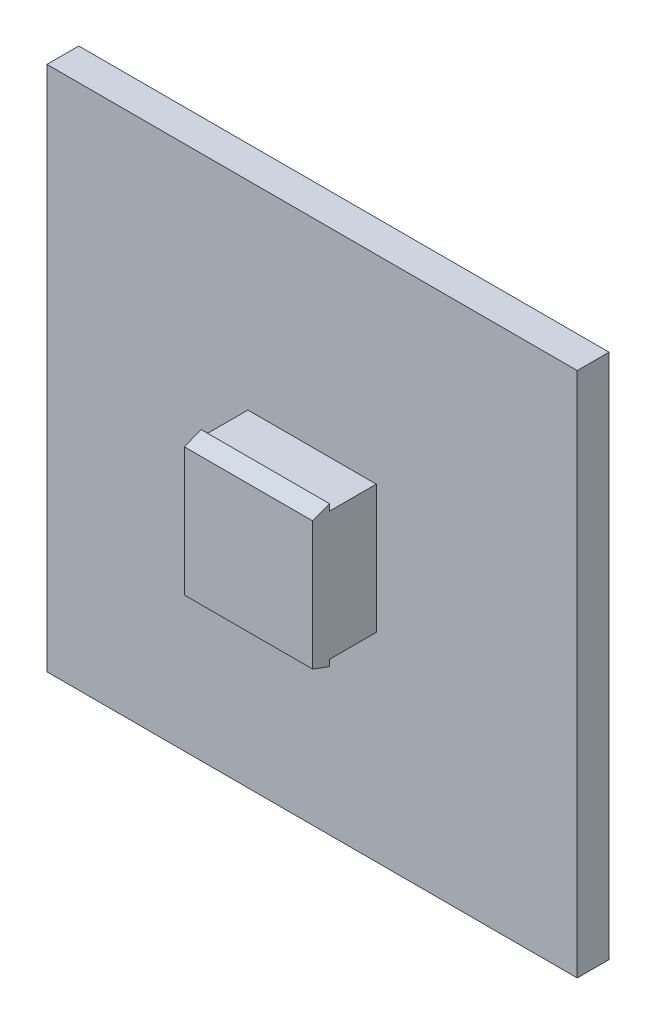
ISO-10303-21;
HEADER;
FILE_DESCRIPTION(('STEP AP214'),'2;1');
FILE_NAME('part.step','',(''),(''),'','','');
FILE_SCHEMA(('AUTOMOTIVE_DESIGN { 1 0 10303 214 1 1 1 1 }'));
ENDSEC;
DATA;
#1=APPLICATION_CONTEXT('core data for automotive mechanical design processes');
#2=APPLICATION_PROTOCOL_DEFINITION('international standard','automotive_design',2000,#1);
#3=PRODUCT_CONTEXT('',#1,'mechanical');
#4=PRODUCT('Part','Part','',(#3));
#5=PRODUCT_RELATED_PRODUCT_CATEGORY('part','',(#4));
#6=PRODUCT_DEFINITION_FORMATION('','',#4);
#7=PRODUCT_DEFINITION_CONTEXT('part definition',#1,'design');
#8=PRODUCT_DEFINITION('design','',#6,#7);
#9=PRODUCT_DEFINITION_SHAPE('','',#8);
#10=(LENGTH_UNIT() NAMED_UNIT(*) SI_UNIT(.MILLI.,.METRE.));
#11=(NAMED_UNIT(*) PLANE_ANGLE_UNIT() SI_UNIT($,.RADIAN.));
#12=(NAMED_UNIT(*) SI_UNIT($,.STERADIAN.) SOLID_ANGLE_UNIT());
#13=UNCERTAINTY_MEASURE_WITH_UNIT(LENGTH_MEASURE(1.E-05),#10,'distance_accuracy_value','');
#14=(GEOMETRIC_REPRESENTATION_CONTEXT(3) GLOBAL_UNCERTAINTY_ASSIGNED_CONTEXT((#13)) GLOBAL_UNIT_ASSIGNED_CONTEXT((#10,
#11,#12)) REPRESENTATION_CONTEXT('',''));
#15=CARTESIAN_POINT('',(0.,0.,0.));
#16=DIRECTION('',(0.,0.,1.));
#17=DIRECTION('',(1.,0.,0.));
#18=AXIS2_PLACEMENT_3D('',#15,#16,#17);
#19=CARTESIAN_POINT('',(12.5,12.4,1.5));
#20=DIRECTION('',(0.,-1.,0.));
#21=DIRECTION('',(0.,0.,-1.));
#22=AXIS2_PLACEMENT_3D('',#19,#20,#21);
#23=PLANE('',#22);
#24=DIRECTION('',(-1.,0.,0.));
#25=VECTOR('',#24,1.);
#26=CARTESIAN_POINT('',(12.5,12.4,0.));
#27=LINE('',#26,#25);
#28=CARTESIAN_POINT('',(12.5,12.4,0.));
#29=VERTEX_POINT('',#28);
#30=CARTESIAN_POINT('',(-12.5,12.4,0.));
#31=VERTEX_POINT('',#30);
#32=EDGE_CURVE('E190',#29,#31,#27,.T.);
#33=ORIENTED_EDGE('',*,*,#32,.T.);
#34=DIRECTION('',(0.,0.,-1.));
#35=VECTOR('',#34,1.);
#36=CARTESIAN_POINT('',(-12.5,12.4,1.5));
#37=LINE('',#36,#35);
#38=CARTESIAN_POINT('',(-12.5,12.4,1.5));
#39=VERTEX_POINT('',#38);
#40=EDGE_CURVE('E11',#39,#31,#37,.T.);
#41=ORIENTED_EDGE('',*,*,#40,.F.);
#42=DIRECTION('',(-1.,0.,0.));
#43=VECTOR('',#42,1.);
#44=CARTESIAN_POINT('',(12.5,12.4,1.5));
#45=LINE('',#44,#43);
#46=CARTESIAN_POINT('',(12.5,12.4,1.5));
#47=VERTEX_POINT('',#46);
#48=EDGE_CURVE('E196',#47,#39,#45,.T.);
#49=ORIENTED_EDGE('',*,*,#48,.F.);
#50=DIRECTION('',(0.,0.,-1.));
#51=VECTOR('',#50,1.);
#52=CARTESIAN_POINT('',(12.5,12.4,1.5));
#53=LINE('',#52,#51);
#54=EDGE_CURVE('E206',#47,#29,#53,.T.);
#55=ORIENTED_EDGE('',*,*,#54,.T.);
#56=EDGE_LOOP('',(#33,#41,#49,#55));
#57=FACE_BOUND('',#56,.T.);
#58=ADVANCED_FACE('F39',(#57),#23,.F.);
#59=CARTESIAN_POINT('',(-12.5,-12.4,1.5));
#60=DIRECTION('',(1.,0.,0.));
#61=DIRECTION('',(0.,0.,-1.));
#62=AXIS2_PLACEMENT_3D('',#59,#60,#61);
#63=PLANE('',#62);
#64=DIRECTION('',(0.,-1.,0.));
#65=VECTOR('',#64,1.);
#66=CARTESIAN_POINT('',(-12.5,-12.4,0.));
#67=LINE('',#66,#65);
#68=CARTESIAN_POINT('',(-12.5,-12.4,0.));
#69=VERTEX_POINT('',#68);
#70=EDGE_CURVE('E209',#31,#69,#67,.T.);
#71=ORIENTED_EDGE('',*,*,#70,.T.);
#72=DIRECTION('',(0.,0.,-1.));
#73=VECTOR('',#72,1.);
#74=CARTESIAN_POINT('',(-12.5,-12.4,1.5));
#75=LINE('',#74,#73);
#76=CARTESIAN_POINT('',(-12.5,-12.4,1.5));
#77=VERTEX_POINT('',#76);
#78=EDGE_CURVE('E46',#77,#69,#75,.T.);
#79=ORIENTED_EDGE('',*,*,#78,.F.);
#80=DIRECTION('',(0.,-1.,0.));
#81=VECTOR('',#80,1.);
#82=CARTESIAN_POINT('',(-12.5,-12.4,1.5));
#83=LINE('',#82,#81);
#84=EDGE_CURVE('E199',#39,#77,#83,.T.);
#85=ORIENTED_EDGE('',*,*,#84,.F.);
#86=ORIENTED_EDGE('',*,*,#40,.T.);
#87=EDGE_LOOP('',(#71,#79,#85,#86));
#88=FACE_BOUND('',#87,.T.);
#89=ADVANCED_FACE('F239',(#88),#63,.F.);
#90=CARTESIAN_POINT('',(12.5,-12.4,1.5));
#91=DIRECTION('',(0.,1.,0.));
#92=DIRECTION('',(0.,0.,1.));
#93=AXIS2_PLACEMENT_3D('',#90,#91,#92);
#94=PLANE('',#93);
#95=DIRECTION('',(1.,0.,0.));
#96=VECTOR('',#95,1.);
#97=CARTESIAN_POINT('',(12.5,-12.4,0.));
#98=LINE('',#97,#96);
#99=CARTESIAN_POINT('',(12.5,-12.4,0.));
#100=VERTEX_POINT('',#99);
#101=EDGE_CURVE('E211',#69,#100,#98,.T.);
#102=ORIENTED_EDGE('',*,*,#101,.T.);
#103=DIRECTION('',(0.,0.,-1.));
#104=VECTOR('',#103,1.);
#105=CARTESIAN_POINT('',(12.5,-12.4,1.5));
#106=LINE('',#105,#104);
#107=CARTESIAN_POINT('',(12.5,-12.4,1.5));
#108=VERTEX_POINT('',#107);
#109=EDGE_CURVE('E216',#108,#100,#106,.T.);
#110=ORIENTED_EDGE('',*,*,#109,.F.);
#111=DIRECTION('',(1.,0.,0.));
#112=VECTOR('',#111,1.);
#113=CARTESIAN_POINT('',(12.5,-12.4,1.5));
#114=LINE('',#113,#112);
#115=EDGE_CURVE('E202',#77,#108,#114,.T.);
#116=ORIENTED_EDGE('',*,*,#115,.F.);
#117=ORIENTED_EDGE('',*,*,#78,.T.);
#118=EDGE_LOOP('',(#102,#110,#116,#117));
#119=FACE_BOUND('',#118,.T.);
#120=ADVANCED_FACE('F223',(#119),#94,.F.);
#121=CARTESIAN_POINT('',(12.5,-12.4,1.5));
#122=DIRECTION('',(-1.,0.,0.));
#123=DIRECTION('',(0.,0.,1.));
#124=AXIS2_PLACEMENT_3D('',#121,#122,#123);
#125=PLANE('',#124);
#126=DIRECTION('',(0.,1.,0.));
#127=VECTOR('',#126,1.);
#128=CARTESIAN_POINT('',(12.5,-12.4,0.));
#129=LINE('',#128,#127);
#130=EDGE_CURVE('E200',#100,#29,#129,.T.);
#131=ORIENTED_EDGE('',*,*,#130,.T.);
#132=ORIENTED_EDGE('',*,*,#54,.F.);
#133=DIRECTION('',(0.,1.,0.));
#134=VECTOR('',#133,1.);
#135=CARTESIAN_POINT('',(12.5,-12.4,1.5));
#136=LINE('',#135,#134);
#137=EDGE_CURVE('E204',#108,#47,#136,.T.);
#138=ORIENTED_EDGE('',*,*,#137,.F.);
#139=ORIENTED_EDGE('',*,*,#109,.T.);
#140=EDGE_LOOP('',(#131,#132,#138,#139));
#141=FACE_BOUND('',#140,.T.);
#142=ADVANCED_FACE('F232',(#141),#125,.F.);
#143=CARTESIAN_POINT('',(0.,0.,1.5));
#144=DIRECTION('',(0.,0.,-1.));
#145=DIRECTION('',(-1.,0.,0.));
#146=AXIS2_PLACEMENT_3D('',#143,#144,#145);
#147=PLANE('',#146);
#148=DIRECTION('',(1.,0.,0.));
#149=VECTOR('',#148,1.);
#150=CARTESIAN_POINT('',(-3.025,-3.025,1.5));
#151=LINE('',#150,#149);
#152=CARTESIAN_POINT('',(-3.025,-3.025,1.5));
#153=VERTEX_POINT('',#152);
#154=CARTESIAN_POINT('',(3.025,-3.025,1.5));
#155=VERTEX_POINT('',#154);
#156=EDGE_CURVE('E171',#153,#155,#151,.T.);
#157=ORIENTED_EDGE('',*,*,#156,.F.);
#158=DIRECTION('',(0.,1.,0.));
#159=VECTOR('',#158,1.);
#160=CARTESIAN_POINT('',(-3.025,-3.025,1.5));
#161=LINE('',#160,#159);
#162=CARTESIAN_POINT('',(-3.025,3.025,1.5));
#163=VERTEX_POINT('',#162);
#164=EDGE_CURVE('E158',#153,#163,#161,.T.);
#165=ORIENTED_EDGE('',*,*,#164,.T.);
#166=DIRECTION('',(1.,0.,0.));
#167=VECTOR('',#166,1.);
#168=CARTESIAN_POINT('',(-3.025,3.025,1.5));
#169=LINE('',#168,#167);
#170=CARTESIAN_POINT('',(3.025,3.025,1.5));
#171=VERTEX_POINT('',#170);
#172=EDGE_CURVE('E180',#163,#171,#169,.T.);
#173=ORIENTED_EDGE('',*,*,#172,.T.);
#174=DIRECTION('',(0.,1.,0.));
#175=VECTOR('',#174,1.);
#176=CARTESIAN_POINT('',(3.025,-3.025,1.5));
#177=LINE('',#176,#175);
#178=EDGE_CURVE('E183',#155,#171,#177,.T.);
#179=ORIENTED_EDGE('',*,*,#178,.F.);
#180=EDGE_LOOP('',(#157,#165,#173,#179));
#181=FACE_BOUND('',#180,.T.);
#182=ORIENTED_EDGE('',*,*,#48,.T.);
#183=ORIENTED_EDGE('',*,*,#84,.T.);
#184=ORIENTED_EDGE('',*,*,#115,.T.);
#185=ORIENTED_EDGE('',*,*,#137,.T.);
#186=EDGE_LOOP('',(#182,#183,#184,#185));
#187=FACE_BOUND('',#186,.T.);
#188=ADVANCED_FACE('F238',(#181,#187),#147,.F.);
#189=CARTESIAN_POINT('',(0.,0.,0.));
#190=DIRECTION('',(0.,0.,-1.));
#191=DIRECTION('',(-1.,0.,0.));
#192=AXIS2_PLACEMENT_3D('',#189,#190,#191);
#193=PLANE('',#192);
#194=ORIENTED_EDGE('',*,*,#32,.F.);
#195=ORIENTED_EDGE('',*,*,#130,.F.);
#196=ORIENTED_EDGE('',*,*,#101,.F.);
#197=ORIENTED_EDGE('',*,*,#70,.F.);
#198=EDGE_LOOP('',(#194,#195,#196,#197));
#199=FACE_BOUND('',#198,.T.);
#200=ADVANCED_FACE('F229',(#199),#193,.T.);
#201=CARTESIAN_POINT('',(-3.025,-3.025,4.5));
#202=DIRECTION('',(-1.,0.,0.));
#203=DIRECTION('',(0.,0.,1.));
#204=AXIS2_PLACEMENT_3D('',#201,#202,#203);
#205=PLANE('',#204);
#206=ORIENTED_EDGE('',*,*,#164,.F.);
#207=DIRECTION('',(0.,0.,-1.));
#208=VECTOR('',#207,1.);
#209=CARTESIAN_POINT('',(-3.025,-3.025,4.5));
#210=LINE('',#209,#208);
#211=CARTESIAN_POINT('',(-3.025,-3.025,3.7));
#212=VERTEX_POINT('',#211);
#213=EDGE_CURVE('E188',#212,#153,#210,.T.);
#214=ORIENTED_EDGE('',*,*,#213,.F.);
#215=DIRECTION('',(0.,-1.,0.));
#216=VECTOR('',#215,1.);
#217=CARTESIAN_POINT('',(-3.025,-3.025,3.7));
#218=LINE('',#217,#216);
#219=CARTESIAN_POINT('',(-3.025,-3.325,3.7));
#220=VERTEX_POINT('',#219);
#221=EDGE_CURVE('E148',#212,#220,#218,.T.);
#222=ORIENTED_EDGE('',*,*,#221,.T.);
#223=DIRECTION('',(0.,0.351123441588392,0.936329177569045));
#224=VECTOR('',#223,1.);
#225=CARTESIAN_POINT('',(-3.025,-3.325,3.7));
#226=LINE('',#225,#224);
#227=CARTESIAN_POINT('',(-3.025,-3.025,4.5));
#228=VERTEX_POINT('',#227);
#229=EDGE_CURVE('E151',#220,#228,#226,.T.);
#230=ORIENTED_EDGE('',*,*,#229,.T.);
#231=DIRECTION('',(0.,1.,0.));
#232=VECTOR('',#231,1.);
#233=CARTESIAN_POINT('',(-3.025,-3.025,4.5));
#234=LINE('',#233,#232);
#235=CARTESIAN_POINT('',(-3.025,3.025,4.5));
#236=VERTEX_POINT('',#235);
#237=EDGE_CURVE('E147',#228,#236,#234,.T.);
#238=ORIENTED_EDGE('',*,*,#237,.T.);
#239=DIRECTION('',(0.,0.351123441588392,-0.936329177569045));
#240=VECTOR('',#239,1.);
#241=CARTESIAN_POINT('',(-3.025,3.325,3.7));
#242=LINE('',#241,#240);
#243=CARTESIAN_POINT('',(-3.025,3.325,3.7));
#244=VERTEX_POINT('',#243);
#245=EDGE_CURVE('E131',#236,#244,#242,.T.);
#246=ORIENTED_EDGE('',*,*,#245,.T.);
#247=DIRECTION('',(0.,-1.,0.));
#248=VECTOR('',#247,1.);
#249=CARTESIAN_POINT('',(-3.025,3.025,3.7));
#250=LINE('',#249,#248);
#251=CARTESIAN_POINT('',(-3.025,3.025,3.7));
#252=VERTEX_POINT('',#251);
#253=EDGE_CURVE('E136',#244,#252,#250,.T.);
#254=ORIENTED_EDGE('',*,*,#253,.T.);
#255=DIRECTION('',(0.,0.,-1.));
#256=VECTOR('',#255,1.);
#257=CARTESIAN_POINT('',(-3.025,3.025,4.5));
#258=LINE('',#257,#256);
#259=EDGE_CURVE('E58',#252,#163,#258,.T.);
#260=ORIENTED_EDGE('',*,*,#259,.T.);
#261=EDGE_LOOP('',(#206,#214,#222,#230,#238,#246,#254,#260));
#262=FACE_BOUND('',#261,.T.);
#263=ADVANCED_FACE('F144',(#262),#205,.T.);
#264=CARTESIAN_POINT('',(-3.025,-3.025,4.5));
#265=DIRECTION('',(0.,1.,0.));
#266=DIRECTION('',(0.,0.,1.));
#267=AXIS2_PLACEMENT_3D('',#264,#265,#266);
#268=PLANE('',#267);
#269=DIRECTION('',(0.,0.,-1.));
#270=VECTOR('',#269,1.);
#271=CARTESIAN_POINT('',(3.025,-3.025,4.5));
#272=LINE('',#271,#270);
#273=CARTESIAN_POINT('',(3.025,-3.025,3.7));
#274=VERTEX_POINT('',#273);
#275=EDGE_CURVE('E191',#274,#155,#272,.T.);
#276=ORIENTED_EDGE('',*,*,#275,.F.);
#277=DIRECTION('',(-1.,0.,0.));
#278=VECTOR('',#277,1.);
#279=CARTESIAN_POINT('',(3.87940037453175,-3.025,3.7));
#280=LINE('',#279,#278);
#281=EDGE_CURVE('E164',#274,#212,#280,.T.);
#282=ORIENTED_EDGE('',*,*,#281,.T.);
#283=ORIENTED_EDGE('',*,*,#213,.T.);
#284=ORIENTED_EDGE('',*,*,#156,.T.);
#285=EDGE_LOOP('',(#276,#282,#283,#284));
#286=FACE_BOUND('',#285,.T.);
#287=ADVANCED_FACE('F256',(#286),#268,.F.);
#288=CARTESIAN_POINT('',(3.025,-3.025,4.5));
#289=DIRECTION('',(-1.,0.,0.));
#290=DIRECTION('',(0.,0.,1.));
#291=AXIS2_PLACEMENT_3D('',#288,#289,#290);
#292=PLANE('',#291);
#293=ORIENTED_EDGE('',*,*,#178,.T.);
#294=DIRECTION('',(0.,0.,-1.));
#295=VECTOR('',#294,1.);
#296=CARTESIAN_POINT('',(3.025,3.025,4.5));
#297=LINE('',#296,#295);
#298=CARTESIAN_POINT('',(3.025,3.025,3.7));
#299=VERTEX_POINT('',#298);
#300=EDGE_CURVE('E193',#299,#171,#297,.T.);
#301=ORIENTED_EDGE('',*,*,#300,.F.);
#302=DIRECTION('',(0.,1.,0.));
#303=VECTOR('',#302,1.);
#304=CARTESIAN_POINT('',(3.025,3.025,3.7));
#305=LINE('',#304,#303);
#306=CARTESIAN_POINT('',(3.025,3.325,3.7));
#307=VERTEX_POINT('',#306);
#308=EDGE_CURVE('E156',#299,#307,#305,.T.);
#309=ORIENTED_EDGE('',*,*,#308,.T.);
#310=DIRECTION('',(0.,-0.351123441588392,0.936329177569045));
#311=VECTOR('',#310,1.);
#312=CARTESIAN_POINT('',(3.025,3.325,3.7));
#313=LINE('',#312,#311);
#314=CARTESIAN_POINT('',(3.025,3.025,4.5));
#315=VERTEX_POINT('',#314);
#316=EDGE_CURVE('E133',#307,#315,#313,.T.);
#317=ORIENTED_EDGE('',*,*,#316,.T.);
#318=DIRECTION('',(0.,1.,0.));
#319=VECTOR('',#318,1.);
#320=CARTESIAN_POINT('',(3.025,-3.025,4.5));
#321=LINE('',#320,#319);
#322=CARTESIAN_POINT('',(3.025,-3.025,4.5));
#323=VERTEX_POINT('',#322);
#324=EDGE_CURVE('E173',#323,#315,#321,.T.);
#325=ORIENTED_EDGE('',*,*,#324,.F.);
#326=DIRECTION('',(0.,-0.351123441588392,-0.936329177569045));
#327=VECTOR('',#326,1.);
#328=CARTESIAN_POINT('',(3.025,-3.325,3.7));
#329=LINE('',#328,#327);
#330=CARTESIAN_POINT('',(3.025,-3.325,3.7));
#331=VERTEX_POINT('',#330);
#332=EDGE_CURVE('E159',#323,#331,#329,.T.);
#333=ORIENTED_EDGE('',*,*,#332,.T.);
#334=DIRECTION('',(0.,1.,0.));
#335=VECTOR('',#334,1.);
#336=CARTESIAN_POINT('',(3.025,-3.025,3.7));
#337=LINE('',#336,#335);
#338=EDGE_CURVE('E161',#331,#274,#337,.T.);
#339=ORIENTED_EDGE('',*,*,#338,.T.);
#340=ORIENTED_EDGE('',*,*,#275,.T.);
#341=EDGE_LOOP('',(#293,#301,#309,#317,#325,#333,#339,#340));
#342=FACE_BOUND('',#341,.T.);
#343=ADVANCED_FACE('F261',(#342),#292,.F.);
#344=CARTESIAN_POINT('',(-3.025,3.025,4.5));
#345=DIRECTION('',(0.,1.,0.));
#346=DIRECTION('',(0.,0.,1.));
#347=AXIS2_PLACEMENT_3D('',#344,#345,#346);
#348=PLANE('',#347);
#349=DIRECTION('',(-1.,0.,0.));
#350=VECTOR('',#349,1.);
#351=CARTESIAN_POINT('',(3.87940037453175,3.025,3.7));
#352=LINE('',#351,#350);
#353=EDGE_CURVE('E53',#299,#252,#352,.T.);
#354=ORIENTED_EDGE('',*,*,#353,.F.);
#355=ORIENTED_EDGE('',*,*,#300,.T.);
#356=ORIENTED_EDGE('',*,*,#172,.F.);
#357=ORIENTED_EDGE('',*,*,#259,.F.);
#358=EDGE_LOOP('',(#354,#355,#356,#357));
#359=FACE_BOUND('',#358,.T.);
#360=ADVANCED_FACE('F257',(#359),#348,.T.);
#361=CARTESIAN_POINT('',(0.,0.,4.5));
#362=DIRECTION('',(0.,0.,-1.));
#363=DIRECTION('',(-1.,0.,0.));
#364=AXIS2_PLACEMENT_3D('',#361,#362,#363);
#365=PLANE('',#364);
#366=ORIENTED_EDGE('',*,*,#237,.F.);
#367=DIRECTION('',(1.,0.,0.));
#368=VECTOR('',#367,1.);
#369=CARTESIAN_POINT('',(-3.025,-3.025,4.5));
#370=LINE('',#369,#368);
#371=EDGE_CURVE('E175',#228,#323,#370,.T.);
#372=ORIENTED_EDGE('',*,*,#371,.T.);
#373=ORIENTED_EDGE('',*,*,#324,.T.);
#374=DIRECTION('',(1.,0.,0.));
#375=VECTOR('',#374,1.);
#376=CARTESIAN_POINT('',(-3.025,3.025,4.5));
#377=LINE('',#376,#375);
#378=EDGE_CURVE('E170',#236,#315,#377,.T.);
#379=ORIENTED_EDGE('',*,*,#378,.F.);
#380=EDGE_LOOP('',(#366,#372,#373,#379));
#381=FACE_BOUND('',#380,.T.);
#382=ADVANCED_FACE('F260',(#381),#365,.F.);
#383=CARTESIAN_POINT('',(3.87940037453175,-3.025,3.7));
#384=DIRECTION('',(0.,0.,-1.));
#385=DIRECTION('',(-1.,0.,0.));
#386=AXIS2_PLACEMENT_3D('',#383,#384,#385);
#387=PLANE('',#386);
#388=ORIENTED_EDGE('',*,*,#338,.F.);
#389=DIRECTION('',(-1.,0.,0.));
#390=VECTOR('',#389,1.);
#391=CARTESIAN_POINT('',(3.87940037453175,-3.325,3.7));
#392=LINE('',#391,#390);
#393=EDGE_CURVE('E162',#331,#220,#392,.T.);
#394=ORIENTED_EDGE('',*,*,#393,.T.);
#395=ORIENTED_EDGE('',*,*,#221,.F.);
#396=ORIENTED_EDGE('',*,*,#281,.F.);
#397=EDGE_LOOP('',(#388,#394,#395,#396));
#398=FACE_BOUND('',#397,.T.);
#399=ADVANCED_FACE('F270',(#398),#387,.T.);
#400=CARTESIAN_POINT('',(3.87940037453175,-3.325,3.7));
#401=DIRECTION('',(0.,-0.936329177569045,0.351123441588392));
#402=DIRECTION('',(0.,-0.351123441588392,-0.936329177569045));
#403=AXIS2_PLACEMENT_3D('',#400,#401,#402);
#404=PLANE('',#403);
#405=ORIENTED_EDGE('',*,*,#332,.F.);
#406=ORIENTED_EDGE('',*,*,#371,.F.);
#407=ORIENTED_EDGE('',*,*,#229,.F.);
#408=ORIENTED_EDGE('',*,*,#393,.F.);
#409=EDGE_LOOP('',(#405,#406,#407,#408));
#410=FACE_BOUND('',#409,.T.);
#411=ADVANCED_FACE('F272',(#410),#404,.T.);
#412=CARTESIAN_POINT('',(3.87940037453175,3.325,3.7));
#413=DIRECTION('',(0.,0.936329177569045,0.351123441588392));
#414=DIRECTION('',(0.,-0.351123441588392,0.936329177569045));
#415=AXIS2_PLACEMENT_3D('',#412,#413,#414);
#416=PLANE('',#415);
#417=ORIENTED_EDGE('',*,*,#316,.F.);
#418=DIRECTION('',(-1.,0.,0.));
#419=VECTOR('',#418,1.);
#420=CARTESIAN_POINT('',(3.87940037453175,3.325,3.7));
#421=LINE('',#420,#419);
#422=EDGE_CURVE('E126',#307,#244,#421,.T.);
#423=ORIENTED_EDGE('',*,*,#422,.T.);
#424=ORIENTED_EDGE('',*,*,#245,.F.);
#425=ORIENTED_EDGE('',*,*,#378,.T.);
#426=EDGE_LOOP('',(#417,#423,#424,#425));
#427=FACE_BOUND('',#426,.T.);
#428=ADVANCED_FACE('F128',(#427),#416,.T.);
#429=CARTESIAN_POINT('',(3.87940037453175,3.025,3.7));
#430=DIRECTION('',(0.,0.,-1.));
#431=DIRECTION('',(-1.,0.,0.));
#432=AXIS2_PLACEMENT_3D('',#429,#430,#431);
#433=PLANE('',#432);
#434=ORIENTED_EDGE('',*,*,#308,.F.);
#435=ORIENTED_EDGE('',*,*,#353,.T.);
#436=ORIENTED_EDGE('',*,*,#253,.F.);
#437=ORIENTED_EDGE('',*,*,#422,.F.);
#438=EDGE_LOOP('',(#434,#435,#436,#437));
#439=FACE_BOUND('',#438,.T.);
#440=ADVANCED_FACE('F139',(#439),#433,.T.);
#441=CLOSED_SHELL('',(#58,#89,#120,#142,#188,#200,#263,#287,#343,#360,#382,#399,#411,#428,#440));
#442=MANIFOLD_SOLID_BREP('B2',#441);
#443=ADVANCED_BREP_SHAPE_REPRESENTATION('',(#18,#442),#14);
#444=SHAPE_DEFINITION_REPRESENTATION(#9,#443);
ENDSEC;
END-ISO-10303-21;
